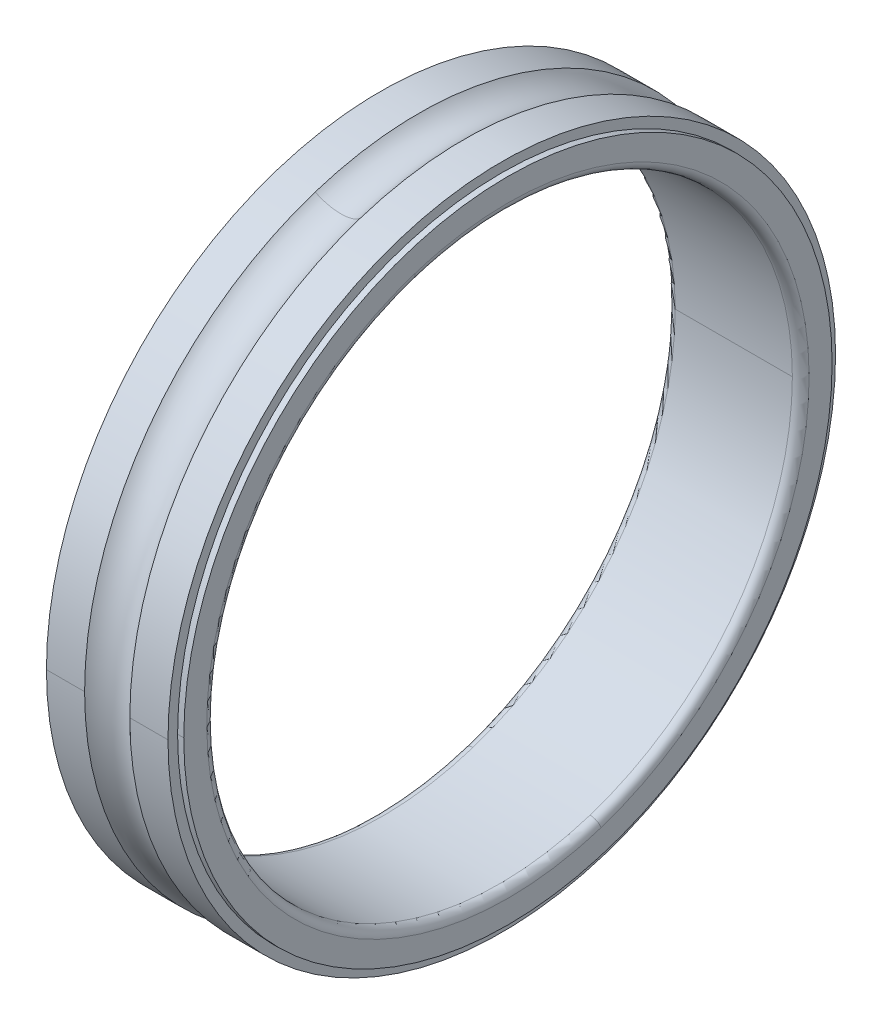
ISO-10303-21;
HEADER;
FILE_DESCRIPTION(('STEP AP214'),'2;1');
FILE_NAME('part.step','',(''),(''),'','','');
FILE_SCHEMA(('AUTOMOTIVE_DESIGN { 1 0 10303 214 1 1 1 1 }'));
ENDSEC;
DATA;
#1=APPLICATION_CONTEXT('core data for automotive mechanical design processes');
#2=APPLICATION_PROTOCOL_DEFINITION('international standard','automotive_design',2000,#1);
#3=PRODUCT_CONTEXT('',#1,'mechanical');
#4=PRODUCT('Part','Part','',(#3));
#5=PRODUCT_RELATED_PRODUCT_CATEGORY('part','',(#4));
#6=PRODUCT_DEFINITION_FORMATION('','',#4);
#7=PRODUCT_DEFINITION_CONTEXT('part definition',#1,'design');
#8=PRODUCT_DEFINITION('design','',#6,#7);
#9=PRODUCT_DEFINITION_SHAPE('','',#8);
#10=(LENGTH_UNIT() NAMED_UNIT(*) SI_UNIT(.MILLI.,.METRE.));
#11=(NAMED_UNIT(*) PLANE_ANGLE_UNIT() SI_UNIT($,.RADIAN.));
#12=(NAMED_UNIT(*) SI_UNIT($,.STERADIAN.) SOLID_ANGLE_UNIT());
#13=UNCERTAINTY_MEASURE_WITH_UNIT(LENGTH_MEASURE(1.E-05),#10,'distance_accuracy_value','');
#14=(GEOMETRIC_REPRESENTATION_CONTEXT(3) GLOBAL_UNCERTAINTY_ASSIGNED_CONTEXT((#13)) GLOBAL_UNIT_ASSIGNED_CONTEXT((#10,
#11,#12)) REPRESENTATION_CONTEXT('',''));
#15=CARTESIAN_POINT('',(0.,0.,0.));
#16=DIRECTION('',(0.,0.,1.));
#17=DIRECTION('',(1.,0.,0.));
#18=AXIS2_PLACEMENT_3D('',#15,#16,#17);
#19=CARTESIAN_POINT('',(0.,38.75,0.));
#20=DIRECTION('',(-1.,0.,0.));
#21=DIRECTION('',(0.,0.,1.));
#22=AXIS2_PLACEMENT_3D('',#19,#20,#21);
#23=PLANE('',#22);
#24=CARTESIAN_POINT('',(0.,0.,0.));
#25=DIRECTION('',(1.,0.,0.));
#26=DIRECTION('',(0.,0.,-1.));
#27=AXIS2_PLACEMENT_3D('',#24,#25,#26);
#28=CIRCLE('',#27,36.);
#29=CARTESIAN_POINT('',(0.,34.2380345866248,11.1246117974979));
#30=VERTEX_POINT('',#29);
#31=CARTESIAN_POINT('',(0.,-34.2380345866248,-11.1246117974979));
#32=VERTEX_POINT('',#31);
#33=EDGE_CURVE('E11',#30,#32,#28,.T.);
#34=ORIENTED_EDGE('',*,*,#33,.T.);
#35=CARTESIAN_POINT('',(0.,-34.2380345866255,-11.1246117974981));
#36=CARTESIAN_POINT('',(0.,-32.4905136770944,-16.5026593726978));
#37=CARTESIAN_POINT('',(0.,-29.6874505260452,-21.5379081719055));
#38=CARTESIAN_POINT('',(0.,-25.9167563443921,-25.9525858908717));
#39=CARTESIAN_POINT('',(0.,-16.8476383750228,-33.0653394526487));
#40=CARTESIAN_POINT('',(0.,-5.76259886805708,-36.2216746869559));
#41=CARTESIAN_POINT('',(0.,0.0253366989584197,-36.6772049650104));
#42=CARTESIAN_POINT('',(0.,11.4676440686657,-35.2937793603178));
#43=CARTESIAN_POINT('',(0.,21.5378223537027,-29.6873746608561));
#44=CARTESIAN_POINT('',(0.,25.9526066103522,-25.9167797569469));
#45=CARTESIAN_POINT('',(0.,33.0653446527884,-16.8476281691741));
#46=CARTESIAN_POINT('',(0.,36.2216435671959,-5.76259586719968));
#47=CARTESIAN_POINT('',(0.,36.6773167839117,0.0253118630132665));
#48=CARTESIAN_POINT('',(0.,35.9853975236189,5.74651289390937));
#49=CARTESIAN_POINT('',(0.,34.2380345866255,11.1246117974981));
#50=B_SPLINE_CURVE_WITH_KNOTS('',5,(#35,#36,#37,#38,#39,#40,#41,#42,#43,#44,#45,#46,#47,#48,
#49),.UNSPECIFIED.,.F.,.F.,(6,3,3,3,6),(0.,0.785398163397448,1.5707963267949,2.35619449019234,
3.14159265358979),.UNSPECIFIED.);
#51=EDGE_CURVE('E28',#32,#30,#50,.T.);
#52=ORIENTED_EDGE('',*,*,#51,.T.);
#53=EDGE_LOOP('',(#34,#52));
#54=FACE_BOUND('',#53,.T.);
#55=CARTESIAN_POINT('',(0.,0.,0.));
#56=DIRECTION('',(1.,0.,0.));
#57=DIRECTION('',(0.,0.,-1.));
#58=AXIS2_PLACEMENT_3D('',#55,#56,#57);
#59=CIRCLE('',#58,38.75);
#60=CARTESIAN_POINT('',(0.,0.,38.75));
#61=VERTEX_POINT('',#60);
#62=CARTESIAN_POINT('',(0.,0.,-38.75));
#63=VERTEX_POINT('',#62);
#64=EDGE_CURVE('E402',#61,#63,#59,.T.);
#65=ORIENTED_EDGE('',*,*,#64,.F.);
#66=CARTESIAN_POINT('',(0.,0.,0.));
#67=DIRECTION('',(1.,0.,0.));
#68=DIRECTION('',(0.,0.,-1.));
#69=AXIS2_PLACEMENT_3D('',#66,#67,#68);
#70=CIRCLE('',#69,38.75);
#71=EDGE_CURVE('E397',#63,#61,#70,.T.);
#72=ORIENTED_EDGE('',*,*,#71,.F.);
#73=EDGE_LOOP('',(#65,#72));
#74=FACE_BOUND('',#73,.T.);
#75=ADVANCED_FACE('F19',(#54,#74),#23,.T.);
#76=CARTESIAN_POINT('',(16.,0.,0.));
#77=DIRECTION('',(1.,0.,0.));
#78=DIRECTION('',(0.,-1.,0.));
#79=AXIS2_PLACEMENT_3D('',#76,#77,#78);
#80=CYLINDRICAL_SURFACE('',#79,38.75);
#81=DIRECTION('',(1.,0.,0.));
#82=VECTOR('',#81,1.);
#83=CARTESIAN_POINT('',(0.,0.,38.75));
#84=LINE('',#83,#82);
#85=CARTESIAN_POINT('',(0.736000000000001,0.,38.75));
#86=VERTEX_POINT('',#85);
#87=EDGE_CURVE('E393',#61,#86,#84,.T.);
#88=ORIENTED_EDGE('',*,*,#87,.T.);
#89=CARTESIAN_POINT('',(0.736,0.,0.));
#90=DIRECTION('',(1.,0.,0.));
#91=DIRECTION('',(0.,0.,-1.));
#92=AXIS2_PLACEMENT_3D('',#89,#90,#91);
#93=CIRCLE('',#92,38.75);
#94=CARTESIAN_POINT('',(0.736,0.,-38.75));
#95=VERTEX_POINT('',#94);
#96=EDGE_CURVE('E388',#95,#86,#93,.T.);
#97=ORIENTED_EDGE('',*,*,#96,.F.);
#98=DIRECTION('',(1.,0.,0.));
#99=VECTOR('',#98,1.);
#100=CARTESIAN_POINT('',(0.,0.,-38.75));
#101=LINE('',#100,#99);
#102=EDGE_CURVE('E383',#63,#95,#101,.T.);
#103=ORIENTED_EDGE('',*,*,#102,.F.);
#104=ORIENTED_EDGE('',*,*,#71,.T.);
#105=EDGE_LOOP('',(#88,#97,#103,#104));
#106=FACE_BOUND('',#105,.T.);
#107=ADVANCED_FACE('F423',(#106),#80,.T.);
#108=CARTESIAN_POINT('',(16.,0.,0.));
#109=DIRECTION('',(1.,0.,0.));
#110=DIRECTION('',(0.,1.,0.));
#111=AXIS2_PLACEMENT_3D('',#108,#109,#110);
#112=CYLINDRICAL_SURFACE('',#111,38.75);
#113=ORIENTED_EDGE('',*,*,#87,.F.);
#114=ORIENTED_EDGE('',*,*,#64,.T.);
#115=ORIENTED_EDGE('',*,*,#102,.T.);
#116=CARTESIAN_POINT('',(0.736,0.,0.));
#117=DIRECTION('',(1.,0.,0.));
#118=DIRECTION('',(0.,0.,-1.));
#119=AXIS2_PLACEMENT_3D('',#116,#117,#118);
#120=CIRCLE('',#119,38.75);
#121=EDGE_CURVE('E378',#86,#95,#120,.T.);
#122=ORIENTED_EDGE('',*,*,#121,.F.);
#123=EDGE_LOOP('',(#113,#114,#115,#122));
#124=FACE_BOUND('',#123,.T.);
#125=ADVANCED_FACE('F418',(#124),#112,.T.);
#126=CARTESIAN_POINT('',(0.736,39.9,0.));
#127=DIRECTION('',(-1.,0.,0.));
#128=DIRECTION('',(0.,0.,1.));
#129=AXIS2_PLACEMENT_3D('',#126,#127,#128);
#130=PLANE('',#129);
#131=ORIENTED_EDGE('',*,*,#96,.T.);
#132=ORIENTED_EDGE('',*,*,#121,.T.);
#133=EDGE_LOOP('',(#131,#132));
#134=FACE_BOUND('',#133,.T.);
#135=CARTESIAN_POINT('',(0.736,0.,0.));
#136=DIRECTION('',(1.,0.,0.));
#137=DIRECTION('',(0.,0.,-1.));
#138=AXIS2_PLACEMENT_3D('',#135,#136,#137);
#139=CIRCLE('',#138,39.9);
#140=CARTESIAN_POINT('',(0.736000000000001,0.,39.9));
#141=VERTEX_POINT('',#140);
#142=CARTESIAN_POINT('',(0.736,0.,-39.9));
#143=VERTEX_POINT('',#142);
#144=EDGE_CURVE('E373',#141,#143,#139,.T.);
#145=ORIENTED_EDGE('',*,*,#144,.F.);
#146=CARTESIAN_POINT('',(0.736,0.,0.));
#147=DIRECTION('',(1.,0.,0.));
#148=DIRECTION('',(0.,0.,-1.));
#149=AXIS2_PLACEMENT_3D('',#146,#147,#148);
#150=CIRCLE('',#149,39.9);
#151=EDGE_CURVE('E368',#143,#141,#150,.T.);
#152=ORIENTED_EDGE('',*,*,#151,.F.);
#153=EDGE_LOOP('',(#145,#152));
#154=FACE_BOUND('',#153,.T.);
#155=ADVANCED_FACE('F425',(#134,#154),#130,.T.);
#156=CARTESIAN_POINT('',(16.,0.,0.));
#157=DIRECTION('',(1.,0.,0.));
#158=DIRECTION('',(0.,-1.,0.));
#159=AXIS2_PLACEMENT_3D('',#156,#157,#158);
#160=CYLINDRICAL_SURFACE('',#159,39.9);
#161=DIRECTION('',(1.,0.,0.));
#162=VECTOR('',#161,1.);
#163=CARTESIAN_POINT('',(0.736000000000001,0.,39.9));
#164=LINE('',#163,#162);
#165=CARTESIAN_POINT('',(5.2976861766257,0.,39.9));
#166=VERTEX_POINT('',#165);
#167=EDGE_CURVE('E364',#141,#166,#164,.T.);
#168=ORIENTED_EDGE('',*,*,#167,.T.);
#169=CARTESIAN_POINT('',(5.2976861766257,0.,0.));
#170=DIRECTION('',(1.,0.,0.));
#171=DIRECTION('',(0.,0.,-1.));
#172=AXIS2_PLACEMENT_3D('',#169,#170,#171);
#173=CIRCLE('',#172,39.9);
#174=CARTESIAN_POINT('',(5.29768617662592,37.9471550001768,12.3297780755605));
#175=VERTEX_POINT('',#174);
#176=EDGE_CURVE('E359',#175,#166,#173,.T.);
#177=ORIENTED_EDGE('',*,*,#176,.F.);
#178=CARTESIAN_POINT('',(5.2976861766257,0.,0.));
#179=DIRECTION('',(1.,0.,0.));
#180=DIRECTION('',(0.,0.,-1.));
#181=AXIS2_PLACEMENT_3D('',#178,#179,#180);
#182=CIRCLE('',#181,39.9);
#183=CARTESIAN_POINT('',(5.2976861766257,0.,-39.9));
#184=VERTEX_POINT('',#183);
#185=EDGE_CURVE('E354',#184,#175,#182,.T.);
#186=ORIENTED_EDGE('',*,*,#185,.F.);
#187=DIRECTION('',(1.,0.,0.));
#188=VECTOR('',#187,1.);
#189=CARTESIAN_POINT('',(0.736000000000001,0.,-39.9));
#190=LINE('',#189,#188);
#191=EDGE_CURVE('E349',#143,#184,#190,.T.);
#192=ORIENTED_EDGE('',*,*,#191,.F.);
#193=ORIENTED_EDGE('',*,*,#151,.T.);
#194=EDGE_LOOP('',(#168,#177,#186,#192,#193));
#195=FACE_BOUND('',#194,.T.);
#196=ADVANCED_FACE('F428',(#195),#160,.T.);
#197=CARTESIAN_POINT('',(16.,0.,0.));
#198=DIRECTION('',(1.,0.,0.));
#199=DIRECTION('',(0.,1.,0.));
#200=AXIS2_PLACEMENT_3D('',#197,#198,#199);
#201=CYLINDRICAL_SURFACE('',#200,39.9);
#202=ORIENTED_EDGE('',*,*,#167,.F.);
#203=ORIENTED_EDGE('',*,*,#144,.T.);
#204=ORIENTED_EDGE('',*,*,#191,.T.);
#205=CARTESIAN_POINT('',(5.2976861766257,0.,0.));
#206=DIRECTION('',(1.,0.,0.));
#207=DIRECTION('',(0.,0.,-1.));
#208=AXIS2_PLACEMENT_3D('',#205,#206,#207);
#209=CIRCLE('',#208,39.9);
#210=CARTESIAN_POINT('',(5.29768617662592,-37.9471550001768,-12.3297780755605));
#211=VERTEX_POINT('',#210);
#212=EDGE_CURVE('E344',#211,#184,#209,.T.);
#213=ORIENTED_EDGE('',*,*,#212,.F.);
#214=CARTESIAN_POINT('',(5.2976861766257,0.,0.));
#215=DIRECTION('',(1.,0.,0.));
#216=DIRECTION('',(0.,0.,-1.));
#217=AXIS2_PLACEMENT_3D('',#214,#215,#216);
#218=CIRCLE('',#217,39.9);
#219=EDGE_CURVE('E339',#166,#211,#218,.T.);
#220=ORIENTED_EDGE('',*,*,#219,.F.);
#221=EDGE_LOOP('',(#202,#203,#204,#213,#220));
#222=FACE_BOUND('',#221,.T.);
#223=ADVANCED_FACE('F434',(#222),#201,.T.);
#224=CARTESIAN_POINT('',(7.99999999999985,0.,0.));
#225=DIRECTION('',(1.,0.,0.));
#226=DIRECTION('',(0.,0.309016994374947,-0.951056516295154));
#227=AXIS2_PLACEMENT_3D('',#224,#225,#226);
#228=TOROIDAL_SURFACE('',#227,42.5,3.74999999999958);
#229=CARTESIAN_POINT('',(7.99999999999985,-40.419901942544,-13.1332222609353));
#230=DIRECTION('',(0.,0.309016994374948,-0.951056516295154));
#231=DIRECTION('',(-0.720617019566464,0.659399184631331,0.214251782766638));
#232=AXIS2_PLACEMENT_3D('',#229,#230,#231);
#233=CIRCLE('',#232,3.74999999999957);
#234=CARTESIAN_POINT('',(10.7023138233738,-37.9471550001768,-12.3297780755605));
#235=VERTEX_POINT('',#234);
#236=EDGE_CURVE('E335',#211,#235,#233,.T.);
#237=ORIENTED_EDGE('',*,*,#236,.T.);
#238=CARTESIAN_POINT('',(10.702313823374,0.,0.));
#239=DIRECTION('',(1.,0.,0.));
#240=DIRECTION('',(0.,0.,-1.));
#241=AXIS2_PLACEMENT_3D('',#238,#239,#240);
#242=CIRCLE('',#241,39.9);
#243=CARTESIAN_POINT('',(10.702313823374,0.,39.9));
#244=VERTEX_POINT('',#243);
#245=EDGE_CURVE('E330',#244,#235,#242,.T.);
#246=ORIENTED_EDGE('',*,*,#245,.F.);
#247=CARTESIAN_POINT('',(10.702313823374,0.,0.));
#248=DIRECTION('',(1.,0.,0.));
#249=DIRECTION('',(0.,0.,-1.));
#250=AXIS2_PLACEMENT_3D('',#247,#248,#249);
#251=CIRCLE('',#250,39.9);
#252=CARTESIAN_POINT('',(10.7023138233738,37.9471550001768,12.3297780755605));
#253=VERTEX_POINT('',#252);
#254=EDGE_CURVE('E325',#253,#244,#251,.T.);
#255=ORIENTED_EDGE('',*,*,#254,.F.);
#256=CARTESIAN_POINT('',(7.99999999999985,40.419901942544,13.1332222609353));
#257=DIRECTION('',(0.,-0.309016994374948,0.951056516295154));
#258=DIRECTION('',(-0.720617019566465,-0.659399184631329,-0.214251782766638));
#259=AXIS2_PLACEMENT_3D('',#256,#257,#258);
#260=CIRCLE('',#259,3.74999999999957);
#261=EDGE_CURVE('E320',#175,#253,#260,.T.);
#262=ORIENTED_EDGE('',*,*,#261,.F.);
#263=ORIENTED_EDGE('',*,*,#176,.T.);
#264=ORIENTED_EDGE('',*,*,#219,.T.);
#265=EDGE_LOOP('',(#237,#246,#255,#262,#263,#264));
#266=FACE_BOUND('',#265,.T.);
#267=ADVANCED_FACE('F441',(#266),#228,.F.);
#268=CARTESIAN_POINT('',(7.99999999999985,0.,0.));
#269=DIRECTION('',(1.,0.,0.));
#270=DIRECTION('',(0.,-0.309016994374947,0.951056516295154));
#271=AXIS2_PLACEMENT_3D('',#268,#269,#270);
#272=TOROIDAL_SURFACE('',#271,42.5,3.74999999999958);
#273=ORIENTED_EDGE('',*,*,#236,.F.);
#274=ORIENTED_EDGE('',*,*,#212,.T.);
#275=ORIENTED_EDGE('',*,*,#185,.T.);
#276=ORIENTED_EDGE('',*,*,#261,.T.);
#277=CARTESIAN_POINT('',(10.702313823374,0.,0.));
#278=DIRECTION('',(1.,0.,0.));
#279=DIRECTION('',(0.,0.,-1.));
#280=AXIS2_PLACEMENT_3D('',#277,#278,#279);
#281=CIRCLE('',#280,39.9);
#282=CARTESIAN_POINT('',(10.702313823374,0.,-39.9));
#283=VERTEX_POINT('',#282);
#284=EDGE_CURVE('E315',#283,#253,#281,.T.);
#285=ORIENTED_EDGE('',*,*,#284,.F.);
#286=CARTESIAN_POINT('',(10.702313823374,0.,0.));
#287=DIRECTION('',(1.,0.,0.));
#288=DIRECTION('',(0.,0.,-1.));
#289=AXIS2_PLACEMENT_3D('',#286,#287,#288);
#290=CIRCLE('',#289,39.9);
#291=EDGE_CURVE('E310',#235,#283,#290,.T.);
#292=ORIENTED_EDGE('',*,*,#291,.F.);
#293=EDGE_LOOP('',(#273,#274,#275,#276,#285,#292));
#294=FACE_BOUND('',#293,.T.);
#295=ADVANCED_FACE('F438',(#294),#272,.F.);
#296=CARTESIAN_POINT('',(16.,0.,0.));
#297=DIRECTION('',(1.,0.,0.));
#298=DIRECTION('',(0.,1.,0.));
#299=AXIS2_PLACEMENT_3D('',#296,#297,#298);
#300=CYLINDRICAL_SURFACE('',#299,39.9);
#301=DIRECTION('',(1.,0.,0.));
#302=VECTOR('',#301,1.);
#303=CARTESIAN_POINT('',(10.702313823374,0.,39.9));
#304=LINE('',#303,#302);
#305=CARTESIAN_POINT('',(15.264,0.,39.9));
#306=VERTEX_POINT('',#305);
#307=EDGE_CURVE('E305',#244,#306,#304,.T.);
#308=ORIENTED_EDGE('',*,*,#307,.F.);
#309=ORIENTED_EDGE('',*,*,#245,.T.);
#310=ORIENTED_EDGE('',*,*,#291,.T.);
#311=DIRECTION('',(1.,0.,0.));
#312=VECTOR('',#311,1.);
#313=CARTESIAN_POINT('',(10.702313823374,0.,-39.9));
#314=LINE('',#313,#312);
#315=CARTESIAN_POINT('',(15.264,0.,-39.9));
#316=VERTEX_POINT('',#315);
#317=EDGE_CURVE('E301',#283,#316,#314,.T.);
#318=ORIENTED_EDGE('',*,*,#317,.T.);
#319=CARTESIAN_POINT('',(15.264,0.,0.));
#320=DIRECTION('',(1.,0.,0.));
#321=DIRECTION('',(0.,0.,-1.));
#322=AXIS2_PLACEMENT_3D('',#319,#320,#321);
#323=CIRCLE('',#322,39.9);
#324=EDGE_CURVE('E296',#306,#316,#323,.T.);
#325=ORIENTED_EDGE('',*,*,#324,.F.);
#326=EDGE_LOOP('',(#308,#309,#310,#318,#325));
#327=FACE_BOUND('',#326,.T.);
#328=ADVANCED_FACE('F447',(#327),#300,.T.);
#329=CARTESIAN_POINT('',(15.264,38.75,0.));
#330=DIRECTION('',(1.,0.,0.));
#331=DIRECTION('',(0.,0.,-1.));
#332=AXIS2_PLACEMENT_3D('',#329,#330,#331);
#333=PLANE('',#332);
#334=CARTESIAN_POINT('',(15.264,0.,0.));
#335=DIRECTION('',(1.,0.,0.));
#336=DIRECTION('',(0.,0.,-1.));
#337=AXIS2_PLACEMENT_3D('',#334,#335,#336);
#338=CIRCLE('',#337,39.9);
#339=EDGE_CURVE('E291',#316,#306,#338,.T.);
#340=ORIENTED_EDGE('',*,*,#339,.T.);
#341=ORIENTED_EDGE('',*,*,#324,.T.);
#342=EDGE_LOOP('',(#340,#341));
#343=FACE_BOUND('',#342,.T.);
#344=CARTESIAN_POINT('',(15.264,0.,0.));
#345=DIRECTION('',(1.,0.,0.));
#346=DIRECTION('',(0.,0.,-1.));
#347=AXIS2_PLACEMENT_3D('',#344,#345,#346);
#348=CIRCLE('',#347,38.75);
#349=CARTESIAN_POINT('',(15.264,0.,38.75));
#350=VERTEX_POINT('',#349);
#351=CARTESIAN_POINT('',(15.264,0.,-38.75));
#352=VERTEX_POINT('',#351);
#353=EDGE_CURVE('E286',#350,#352,#348,.T.);
#354=ORIENTED_EDGE('',*,*,#353,.F.);
#355=CARTESIAN_POINT('',(15.264,0.,0.));
#356=DIRECTION('',(1.,0.,0.));
#357=DIRECTION('',(0.,0.,-1.));
#358=AXIS2_PLACEMENT_3D('',#355,#356,#357);
#359=CIRCLE('',#358,38.75);
#360=EDGE_CURVE('E281',#352,#350,#359,.T.);
#361=ORIENTED_EDGE('',*,*,#360,.F.);
#362=EDGE_LOOP('',(#354,#361));
#363=FACE_BOUND('',#362,.T.);
#364=ADVANCED_FACE('F451',(#343,#363),#333,.T.);
#365=CARTESIAN_POINT('',(16.,0.,0.));
#366=DIRECTION('',(1.,0.,0.));
#367=DIRECTION('',(0.,-1.,0.));
#368=AXIS2_PLACEMENT_3D('',#365,#366,#367);
#369=CYLINDRICAL_SURFACE('',#368,38.75);
#370=DIRECTION('',(1.,0.,0.));
#371=VECTOR('',#370,1.);
#372=CARTESIAN_POINT('',(15.264,0.,38.75));
#373=LINE('',#372,#371);
#374=CARTESIAN_POINT('',(16.,0.,38.75));
#375=VERTEX_POINT('',#374);
#376=EDGE_CURVE('E277',#350,#375,#373,.T.);
#377=ORIENTED_EDGE('',*,*,#376,.T.);
#378=CARTESIAN_POINT('',(16.,0.,0.));
#379=DIRECTION('',(1.,0.,0.));
#380=DIRECTION('',(0.,0.,-1.));
#381=AXIS2_PLACEMENT_3D('',#378,#379,#380);
#382=CIRCLE('',#381,38.75);
#383=CARTESIAN_POINT('',(16.,0.,-38.75));
#384=VERTEX_POINT('',#383);
#385=EDGE_CURVE('E272',#384,#375,#382,.T.);
#386=ORIENTED_EDGE('',*,*,#385,.F.);
#387=DIRECTION('',(1.,0.,0.));
#388=VECTOR('',#387,1.);
#389=CARTESIAN_POINT('',(15.264,0.,-38.75));
#390=LINE('',#389,#388);
#391=EDGE_CURVE('E267',#352,#384,#390,.T.);
#392=ORIENTED_EDGE('',*,*,#391,.F.);
#393=ORIENTED_EDGE('',*,*,#360,.T.);
#394=EDGE_LOOP('',(#377,#386,#392,#393));
#395=FACE_BOUND('',#394,.T.);
#396=ADVANCED_FACE('F454',(#395),#369,.T.);
#397=CARTESIAN_POINT('',(16.,0.,0.));
#398=DIRECTION('',(1.,0.,0.));
#399=DIRECTION('',(0.,1.,0.));
#400=AXIS2_PLACEMENT_3D('',#397,#398,#399);
#401=CYLINDRICAL_SURFACE('',#400,38.75);
#402=ORIENTED_EDGE('',*,*,#376,.F.);
#403=ORIENTED_EDGE('',*,*,#353,.T.);
#404=ORIENTED_EDGE('',*,*,#391,.T.);
#405=CARTESIAN_POINT('',(16.,0.,0.));
#406=DIRECTION('',(1.,0.,0.));
#407=DIRECTION('',(0.,0.,-1.));
#408=AXIS2_PLACEMENT_3D('',#405,#406,#407);
#409=CIRCLE('',#408,38.75);
#410=EDGE_CURVE('E264',#375,#384,#409,.T.);
#411=ORIENTED_EDGE('',*,*,#410,.F.);
#412=EDGE_LOOP('',(#402,#403,#404,#411));
#413=FACE_BOUND('',#412,.T.);
#414=ADVANCED_FACE('F460',(#413),#401,.T.);
#415=CARTESIAN_POINT('',(16.,36.,0.));
#416=DIRECTION('',(1.,0.,0.));
#417=DIRECTION('',(0.,0.,-1.));
#418=AXIS2_PLACEMENT_3D('',#415,#416,#417);
#419=PLANE('',#418);
#420=ORIENTED_EDGE('',*,*,#385,.T.);
#421=ORIENTED_EDGE('',*,*,#410,.T.);
#422=EDGE_LOOP('',(#420,#421));
#423=FACE_BOUND('',#422,.T.);
#424=CARTESIAN_POINT('',(16.,-34.238034586624,-11.1246117974977));
#425=CARTESIAN_POINT('',(16.,-34.0560202515641,-11.6848347553448));
#426=CARTESIAN_POINT('',(16.,-33.8602330694235,-12.2405815259679));
#427=CARTESIAN_POINT('',(16.,-33.4416360222106,-13.3418033662211));
#428=CARTESIAN_POINT('',(16.,-33.2188261571385,-13.8872784358512));
#429=CARTESIAN_POINT('',(16.,-32.7467067552925,-14.9666375475738));
#430=CARTESIAN_POINT('',(16.,-32.4973972185186,-15.5005215896662));
#431=CARTESIAN_POINT('',(16.,-31.9728827680247,-16.5554138740863));
#432=CARTESIAN_POINT('',(16.,-31.6976778543046,-17.076422116414));
#433=CARTESIAN_POINT('',(16.,-31.1220346549341,-18.1043072713654));
#434=CARTESIAN_POINT('',(16.,-30.8215963692837,-18.6111841839891));
#435=CARTESIAN_POINT('',(16.,-30.1962104728585,-19.609585669254));
#436=CARTESIAN_POINT('',(16.,-29.8712628620837,-20.1011102418952));
#437=CARTESIAN_POINT('',(16.,-29.1976410717506,-21.0676228944912));
#438=CARTESIAN_POINT('',(16.,-28.8489668921923,-21.5426109744459));
#439=CARTESIAN_POINT('',(16.,-28.1287319699327,-22.4749063610031));
#440=CARTESIAN_POINT('',(16.,-27.7571712272314,-22.9322136676055));
#441=CARTESIAN_POINT('',(16.,-26.9920582959684,-23.8280458121658));
#442=CARTESIAN_POINT('',(16.,-26.5985061074067,-24.2665706501236));
#443=CARTESIAN_POINT('',(16.,-25.7903583874804,-25.1237814131682));
#444=CARTESIAN_POINT('',(16.,-25.3757628561159,-25.5424673382551));
#445=CARTESIAN_POINT('',(16.,-24.5265272471677,-26.3589916243529));
#446=CARTESIAN_POINT('',(16.,-24.0918871695841,-26.7568299853637));
#447=CARTESIAN_POINT('',(16.,-23.2036095543128,-27.5307007158886));
#448=CARTESIAN_POINT('',(16.,-22.749972016625,-27.9067330854025));
#449=CARTESIAN_POINT('',(16.,-21.8247923336811,-28.6360859380087));
#450=CARTESIAN_POINT('',(16.,-21.3532501884251,-28.989406421101));
#451=CARTESIAN_POINT('',(16.,-20.393397276682,-29.6724843208757));
#452=CARTESIAN_POINT('',(16.,-19.905086510195,-30.0022417375581));
#453=CARTESIAN_POINT('',(16.,-18.9128727393953,-30.637399090012));
#454=CARTESIAN_POINT('',(16.,-18.4089697350828,-30.9427990257836));
#455=CARTESIAN_POINT('',(16.,-17.3867854351068,-31.5285056812209));
#456=CARTESIAN_POINT('',(16.,-16.8685041394433,-31.8088124008868));
#457=CARTESIAN_POINT('',(16.,-15.8188118418026,-32.343657340673));
#458=CARTESIAN_POINT('',(16.,-15.2874008398255,-32.5981955607934));
#459=CARTESIAN_POINT('',(16.,-14.2127293452073,-33.0808902966215));
#460=CARTESIAN_POINT('',(16.,-13.6694688525663,-33.3090468123293));
#461=CARTESIAN_POINT('',(16.,-12.5724071387313,-33.7384284903017));
#462=CARTESIAN_POINT('',(16.,-12.0186059175373,-33.9396536525664));
#463=CARTESIAN_POINT('',(16.,-10.9017969022453,-34.3146878546115));
#464=CARTESIAN_POINT('',(16.,-10.3387891081474,-34.4884968943919));
#465=CARTESIAN_POINT('',(16.,-9.20492328213716,-34.8082801302678));
#466=CARTESIAN_POINT('',(16.,-8.63406525022492,-34.9542543263632));
#467=CARTESIAN_POINT('',(16.,-7.48587419558629,-35.218016210245));
#468=CARTESIAN_POINT('',(16.,-6.9085411728599,-35.3358038980313));
#469=CARTESIAN_POINT('',(16.,-5.74879098241311,-35.5429090044379));
#470=CARTESIAN_POINT('',(16.,-5.16637381469272,-35.6322264230581));
#471=CARTESIAN_POINT('',(16.,-3.99785842822867,-35.7821758176479));
#472=CARTESIAN_POINT('',(16.,-3.41176020948503,-35.8428077936174));
#473=CARTESIAN_POINT('',(16.,-2.23729468291958,-35.9352402351647));
#474=CARTESIAN_POINT('',(16.,-1.64892737509779,-35.9670407007426));
#475=CARTESIAN_POINT('',(16.,-0.471341098755479,-36.0017335113998));
#476=CARTESIAN_POINT('',(16.,0.117877869765028,-36.0046258564791));
#477=CARTESIAN_POINT('',(16.,1.29574798740012,-35.9814954582265));
#478=CARTESIAN_POINT('',(16.,1.8843991365147,-35.9554727148945));
#479=CARTESIAN_POINT('',(16.,3.05971550315996,-35.8745748308875));
#480=CARTESIAN_POINT('',(16.,3.64638072069064,-35.8196996902124));
#481=CARTESIAN_POINT('',(16.,4.81631189627325,-35.6812292105393));
#482=CARTESIAN_POINT('',(16.,5.39957785432519,-35.5976338715413));
#483=CARTESIAN_POINT('',(16.,6.56130537216933,-35.4019243837163));
#484=CARTESIAN_POINT('',(16.,7.13976693196153,-35.2898102348892));
#485=CARTESIAN_POINT('',(16.,8.29049208872139,-35.0373332202106));
#486=CARTESIAN_POINT('',(16.,8.86275568568905,-34.896970354359));
#487=CARTESIAN_POINT('',(16.,9.99970628367037,-34.5883340520694));
#488=CARTESIAN_POINT('',(16.,10.564393284684,-34.4200606156315));
#489=CARTESIAN_POINT('',(16.,11.6848303103112,-34.0560085576166));
#490=CARTESIAN_POINT('',(16.,12.2405803349246,-33.8602299360397));
#491=CARTESIAN_POINT('',(16.,13.3418045572641,-33.4416391555945));
#492=CARTESIAN_POINT('',(16.,13.8872787549902,-33.2188269967261));
#493=CARTESIAN_POINT('',(16.,14.9666372284346,-32.7467059157048));
#494=CARTESIAN_POINT('',(16.,15.500521504153,-32.4973969935519));
#495=CARTESIAN_POINT('',(16.,16.5554139595992,-31.9728829929916));
#496=CARTESIAN_POINT('',(16.,17.076422139327,-31.6976779145843));
#497=CARTESIAN_POINT('',(16.,18.1043072484521,-31.1220345946544));
#498=CARTESIAN_POINT('',(16.,18.6111841778494,-30.8215963531318));
#499=CARTESIAN_POINT('',(16.,19.6095856753935,-30.1962104890105));
#500=CARTESIAN_POINT('',(16.,20.1011102435402,-29.8712628664117));
#501=CARTESIAN_POINT('',(16.,21.067622892846,-29.1976410674228));
#502=CARTESIAN_POINT('',(16.,21.542610974005,-28.8489668910327));
#503=CARTESIAN_POINT('',(16.,22.4749063614438,-28.1287319710924));
#504=CARTESIAN_POINT('',(16.,22.9322136677235,-27.7571712275422));
#505=CARTESIAN_POINT('',(16.,23.8280458120476,-26.9920582956577));
#506=CARTESIAN_POINT('',(16.,24.2665706500918,-26.5985061073235));
#507=CARTESIAN_POINT('',(16.,25.1237814131998,-25.7903583875637));
#508=CARTESIAN_POINT('',(16.,25.5424673382635,-25.3757628561382));
#509=CARTESIAN_POINT('',(16.,26.3589916243443,-24.5265272471455));
#510=CARTESIAN_POINT('',(16.,26.7568299853614,-24.0918871695782));
#511=CARTESIAN_POINT('',(16.,27.5307007158908,-23.2036095543188));
#512=CARTESIAN_POINT('',(16.,27.906733085403,-22.7499720166266));
#513=CARTESIAN_POINT('',(16.,28.6360859380081,-21.8247923336796));
#514=CARTESIAN_POINT('',(16.,28.9894064211008,-21.3532501884248));
#515=CARTESIAN_POINT('',(16.,29.6724843208758,-20.3933972766826));
#516=CARTESIAN_POINT('',(16.,30.002241737558,-19.9050865101952));
#517=CARTESIAN_POINT('',(16.,30.6373990900119,-18.9128727393953));
#518=CARTESIAN_POINT('',(16.,30.9427990257835,-18.4089697350829));
#519=CARTESIAN_POINT('',(16.,31.5285056812209,-17.3867854351069));
#520=CARTESIAN_POINT('',(16.,31.8088124008867,-16.8685041394434));
#521=CARTESIAN_POINT('',(16.,32.3436573406729,-15.8188118418027));
#522=CARTESIAN_POINT('',(16.,32.5981955607933,-15.2874008398256));
#523=CARTESIAN_POINT('',(16.,33.0808902966215,-14.2127293452074));
#524=CARTESIAN_POINT('',(16.,33.3090468123294,-13.6694688525664));
#525=CARTESIAN_POINT('',(16.,33.7384284903016,-12.5724071387314));
#526=CARTESIAN_POINT('',(16.,33.9396536525659,-12.0186059175375));
#527=CARTESIAN_POINT('',(16.,34.3146878546119,-10.9017969022453));
#528=CARTESIAN_POINT('',(16.,34.4884968943935,-10.338789108147));
#529=CARTESIAN_POINT('',(16.,34.8082801302661,-9.2049232821377));
#530=CARTESIAN_POINT('',(16.,34.954254326357,-8.63406525022669));
#531=CARTESIAN_POINT('',(16.,35.2180162102511,-7.48587419558471));
#532=CARTESIAN_POINT('',(16.,35.3358038980543,-6.90854117285374));
#533=CARTESIAN_POINT('',(16.,35.5429090044148,-5.74879098241946));
#534=CARTESIAN_POINT('',(16.,35.6322264229721,-5.16637381471615));
#535=CARTESIAN_POINT('',(16.,35.7821758177338,-3.99785842820544));
#536=CARTESIAN_POINT('',(16.,35.8428077939382,-3.41176020939805));
#537=CARTESIAN_POINT('',(16.,35.9352402348439,-2.23729468300679));
#538=CARTESIAN_POINT('',(16.,35.9670406995453,-1.64892737542292));
#539=CARTESIAN_POINT('',(16.,36.0017335125971,-0.471341098430592));
#540=CARTESIAN_POINT('',(16.,36.0046258609474,0.117877870977869));
#541=CARTESIAN_POINT('',(16.,35.9814954537582,1.29574798618704));
#542=CARTESIAN_POINT('',(16.,35.9554726982186,1.88439913198774));
#543=CARTESIAN_POINT('',(16.,35.8745748475634,3.05971550768668));
#544=CARTESIAN_POINT('',(16.,35.8196997524477,3.64638073758492));
#545=CARTESIAN_POINT('',(16.,35.681229148304,4.81631187937879));
#546=CARTESIAN_POINT('',(16.,35.597633639276,5.39957779127443));
#547=CARTESIAN_POINT('',(16.,35.4019246159816,6.56130543521992));
#548=CARTESIAN_POINT('',(16.,35.2898111017152,7.13976716726977));
#549=CARTESIAN_POINT('',(16.,35.0373323533847,8.29049185341297));
#550=CARTESIAN_POINT('',(16.,34.8969671193207,8.86275480750632));
#551=CARTESIAN_POINT('',(16.,34.5883372871078,9.99970716185291));
#552=CARTESIAN_POINT('',(16.,34.420072688959,10.5643965621061));
#553=CARTESIAN_POINT('',(16.,34.2380345866241,11.1246117974975));
#554=B_SPLINE_CURVE_WITH_KNOTS('',3,(#424,#425,#426,#427,#428,#429,#430,#431,#432,#433,#434,
#435,#436,#437,#438,#439,#440,#441,#442,#443,#444,#445,#446,#447,#448,#449,#450,#451,#452,#453,
#454,#455,#456,#457,#458,#459,#460,#461,#462,#463,#464,#465,#466,#467,#468,#469,#470,#471,#472,
#473,#474,#475,#476,#477,#478,#479,#480,#481,#482,#483,#484,#485,#486,#487,#488,#489,#490,#491,
#492,#493,#494,#495,#496,#497,#498,#499,#500,#501,#502,#503,#504,#505,#506,#507,#508,#509,#510,
#511,#512,#513,#514,#515,#516,#517,#518,#519,#520,#521,#522,#523,#524,#525,#526,#527,#528,#529,
#530,#531,#532,#533,#534,#535,#536,#537,#538,#539,#540,#541,#542,#543,#544,#545,#546,#547,#548,
#549,#550,#551,#552,#553),.UNSPECIFIED.,.F.,.F.,(4,2,2,2,2,2,2,2,2,2,2,2,2,2,2,2,2,2,2,2,2,2,2,
2,2,2,2,2,2,2,2,2,2,2,2,2,2,2,2,2,2,2,2,2,2,2,2,2,2,2,2,2,2,2,2,2,2,2,2,2,2,2,2,2,4),(0.,
1.7669684536496,3.53393690729921,5.30090536094882,7.06787381459842,8.83484226824802,
10.6018107218976,12.3687791755472,14.1357476291968,15.9027160828464,17.669684536496,
19.4366529901457,21.2036214437953,22.9705898974449,24.7375583510945,26.5045268047441,
28.2714952583937,30.0384637120433,31.8054321656929,33.5724006193425,35.3393690729921,
37.1063375266417,38.8733059802913,40.6402744339409,42.4072428875905,44.1742113412402,
45.9411797948897,47.7081482485394,49.475116702189,51.2420851558386,53.0090536094882,
54.7760220631378,56.5429905167874,58.309958970437,60.0769274240866,61.8438958777362,
63.6108643313858,65.3778327850354,67.144801238685,68.9117696923346,70.6787381459843,
72.4457065996339,74.2126750532834,75.9796435069331,77.7466119605827,79.5135804142323,
81.2805488678819,83.0475173215315,84.8144857751811,86.5814542288307,88.3484226824803,
90.1153911361299,91.8823595897795,93.6493280434291,95.4162964970787,97.1832649507283,
98.9502334043779,100.717201858028,102.484170311677,104.251138765327,106.018107218976,
107.785075672626,109.552044126276,111.319012579925,113.085981033575),.UNSPECIFIED.);
#555=CARTESIAN_POINT('',(16.,-34.2380345866241,-11.1246117974976));
#556=VERTEX_POINT('',#555);
#557=CARTESIAN_POINT('',(16.,34.2380345866241,11.1246117974976));
#558=VERTEX_POINT('',#557);
#559=EDGE_CURVE('E263',#556,#558,#554,.T.);
#560=ORIENTED_EDGE('',*,*,#559,.F.);
#561=CARTESIAN_POINT('',(16.,34.238034586624,11.1246117974977));
#562=CARTESIAN_POINT('',(16.,34.0560202515641,11.6848347553448));
#563=CARTESIAN_POINT('',(16.,33.8602330694235,12.2405815259679));
#564=CARTESIAN_POINT('',(16.,33.4416360222106,13.3418033662211));
#565=CARTESIAN_POINT('',(16.,33.2188261571385,13.8872784358512));
#566=CARTESIAN_POINT('',(16.,32.7467067552925,14.9666375475738));
#567=CARTESIAN_POINT('',(16.,32.4973972185186,15.5005215896662));
#568=CARTESIAN_POINT('',(16.,31.9728827680247,16.5554138740863));
#569=CARTESIAN_POINT('',(16.,31.6976778543046,17.076422116414));
#570=CARTESIAN_POINT('',(16.,31.1220346549341,18.1043072713654));
#571=CARTESIAN_POINT('',(16.,30.8215963692837,18.6111841839891));
#572=CARTESIAN_POINT('',(16.,30.1962104728585,19.609585669254));
#573=CARTESIAN_POINT('',(16.,29.8712628620837,20.1011102418952));
#574=CARTESIAN_POINT('',(16.,29.1976410717506,21.0676228944912));
#575=CARTESIAN_POINT('',(16.,28.8489668921923,21.5426109744459));
#576=CARTESIAN_POINT('',(16.,28.1287319699327,22.4749063610031));
#577=CARTESIAN_POINT('',(16.,27.7571712272314,22.9322136676055));
#578=CARTESIAN_POINT('',(16.,26.9920582959684,23.8280458121658));
#579=CARTESIAN_POINT('',(16.,26.5985061074067,24.2665706501236));
#580=CARTESIAN_POINT('',(16.,25.7903583874804,25.1237814131683));
#581=CARTESIAN_POINT('',(16.,25.3757628561159,25.5424673382551));
#582=CARTESIAN_POINT('',(16.,24.5265272471677,26.3589916243529));
#583=CARTESIAN_POINT('',(16.,24.0918871695841,26.7568299853638));
#584=CARTESIAN_POINT('',(16.,23.2036095543127,27.5307007158886));
#585=CARTESIAN_POINT('',(16.,22.7499720166249,27.9067330854025));
#586=CARTESIAN_POINT('',(16.,21.8247923336811,28.6360859380088));
#587=CARTESIAN_POINT('',(16.,21.3532501884251,28.9894064211011));
#588=CARTESIAN_POINT('',(16.,20.393397276682,29.6724843208757));
#589=CARTESIAN_POINT('',(16.,19.905086510195,30.0022417375581));
#590=CARTESIAN_POINT('',(16.,18.9128727393953,30.637399090012));
#591=CARTESIAN_POINT('',(16.,18.4089697350828,30.9427990257836));
#592=CARTESIAN_POINT('',(16.,17.3867854351067,31.528505681221));
#593=CARTESIAN_POINT('',(16.,16.8685041394433,31.8088124008868));
#594=CARTESIAN_POINT('',(16.,15.8188118418026,32.343657340673));
#595=CARTESIAN_POINT('',(16.,15.2874008398254,32.5981955607934));
#596=CARTESIAN_POINT('',(16.,14.2127293452073,33.0808902966215));
#597=CARTESIAN_POINT('',(16.,13.6694688525663,33.3090468123293));
#598=CARTESIAN_POINT('',(16.,12.5724071387313,33.7384284903017));
#599=CARTESIAN_POINT('',(16.,12.0186059175373,33.9396536525664));
#600=CARTESIAN_POINT('',(16.,10.9017969022453,34.3146878546115));
#601=CARTESIAN_POINT('',(16.,10.3387891081473,34.4884968943919));
#602=CARTESIAN_POINT('',(16.,9.20492328213712,34.8082801302678));
#603=CARTESIAN_POINT('',(16.,8.63406525022488,34.9542543263632));
#604=CARTESIAN_POINT('',(16.,7.48587419558624,35.218016210245));
#605=CARTESIAN_POINT('',(16.,6.90854117285984,35.3358038980313));
#606=CARTESIAN_POINT('',(16.,5.74879098241304,35.5429090044379));
#607=CARTESIAN_POINT('',(16.,5.16637381469265,35.6322264230581));
#608=CARTESIAN_POINT('',(16.,3.99785842822861,35.7821758176479));
#609=CARTESIAN_POINT('',(16.,3.41176020948497,35.8428077936174));
#610=CARTESIAN_POINT('',(16.,2.23729468291954,35.9352402351647));
#611=CARTESIAN_POINT('',(16.,1.64892737509775,35.9670407007426));
#612=CARTESIAN_POINT('',(16.,0.47134109875544,36.0017335113998));
#613=CARTESIAN_POINT('',(16.,-0.117877869765072,36.0046258564791));
#614=CARTESIAN_POINT('',(16.,-1.29574798740016,35.9814954582265));
#615=CARTESIAN_POINT('',(16.,-1.88439913651474,35.9554727148945));
#616=CARTESIAN_POINT('',(16.,-3.05971550316,35.8745748308875));
#617=CARTESIAN_POINT('',(16.,-3.64638072069068,35.8196996902124));
#618=CARTESIAN_POINT('',(16.,-4.8163118962733,35.6812292105393));
#619=CARTESIAN_POINT('',(16.,-5.39957785432524,35.5976338715413));
#620=CARTESIAN_POINT('',(16.,-6.56130537216939,35.4019243837163));
#621=CARTESIAN_POINT('',(16.,-7.13976693196158,35.2898102348892));
#622=CARTESIAN_POINT('',(16.,-8.29049208872145,35.0373332202106));
#623=CARTESIAN_POINT('',(16.,-8.86275568568911,34.896970354359));
#624=CARTESIAN_POINT('',(16.,-9.99970628367043,34.5883340520694));
#625=CARTESIAN_POINT('',(16.,-10.5643932846841,34.4200606156315));
#626=CARTESIAN_POINT('',(16.,-11.6848303103112,34.0560085576166));
#627=CARTESIAN_POINT('',(16.,-12.2405803349247,33.8602299360397));
#628=CARTESIAN_POINT('',(16.,-13.3418045572642,33.4416391555945));
#629=CARTESIAN_POINT('',(16.,-13.8872787549903,33.2188269967261));
#630=CARTESIAN_POINT('',(16.,-14.9666372284347,32.7467059157048));
#631=CARTESIAN_POINT('',(16.,-15.5005215041531,32.4973969935518));
#632=CARTESIAN_POINT('',(16.,-16.5554139595993,31.9728829929916));
#633=CARTESIAN_POINT('',(16.,-17.0764221393271,31.6976779145843));
#634=CARTESIAN_POINT('',(16.,-18.1043072484522,31.1220345946544));
#635=CARTESIAN_POINT('',(16.,-18.6111841778495,30.8215963531318));
#636=CARTESIAN_POINT('',(16.,-19.6095856753935,30.1962104890104));
#637=CARTESIAN_POINT('',(16.,-20.1011102435403,29.8712628664117));
#638=CARTESIAN_POINT('',(16.,-21.067622892846,29.1976410674228));
#639=CARTESIAN_POINT('',(16.,-21.5426109740051,28.8489668910327));
#640=CARTESIAN_POINT('',(16.,-22.4749063614438,28.1287319710924));
#641=CARTESIAN_POINT('',(16.,-22.9322136677236,27.7571712275422));
#642=CARTESIAN_POINT('',(16.,-23.8280458120476,26.9920582956577));
#643=CARTESIAN_POINT('',(16.,-24.2665706500919,26.5985061073234));
#644=CARTESIAN_POINT('',(16.,-25.1237814131999,25.7903583875637));
#645=CARTESIAN_POINT('',(16.,-25.5424673382636,25.3757628561382));
#646=CARTESIAN_POINT('',(16.,-26.3589916243444,24.5265272471454));
#647=CARTESIAN_POINT('',(16.,-26.7568299853614,24.0918871695782));
#648=CARTESIAN_POINT('',(16.,-27.5307007158908,23.2036095543188));
#649=CARTESIAN_POINT('',(16.,-27.9067330854031,22.7499720166266));
#650=CARTESIAN_POINT('',(16.,-28.6360859380081,21.8247923336796));
#651=CARTESIAN_POINT('',(16.,-28.9894064211009,21.3532501884247));
#652=CARTESIAN_POINT('',(16.,-29.6724843208758,20.3933972766825));
#653=CARTESIAN_POINT('',(16.,-30.0022417375581,19.9050865101951));
#654=CARTESIAN_POINT('',(16.,-30.6373990900119,18.9128727393953));
#655=CARTESIAN_POINT('',(16.,-30.9427990257835,18.4089697350828));
#656=CARTESIAN_POINT('',(16.,-31.528505681221,17.3867854351068));
#657=CARTESIAN_POINT('',(16.,-31.8088124008868,16.8685041394433));
#658=CARTESIAN_POINT('',(16.,-32.343657340673,15.8188118418027));
#659=CARTESIAN_POINT('',(16.,-32.5981955607933,15.2874008398255));
#660=CARTESIAN_POINT('',(16.,-33.0808902966215,14.2127293452073));
#661=CARTESIAN_POINT('',(16.,-33.3090468123294,13.6694688525663));
#662=CARTESIAN_POINT('',(16.,-33.7384284903016,12.5724071387314));
#663=CARTESIAN_POINT('',(16.,-33.9396536525659,12.0186059175374));
#664=CARTESIAN_POINT('',(16.,-34.3146878546119,10.9017969022452));
#665=CARTESIAN_POINT('',(16.,-34.4884968943935,10.3387891081469));
#666=CARTESIAN_POINT('',(16.,-34.8082801302661,9.20492328213761));
#667=CARTESIAN_POINT('',(16.,-34.9542543263571,8.63406525022659));
#668=CARTESIAN_POINT('',(16.,-35.2180162102512,7.48587419558461));
#669=CARTESIAN_POINT('',(16.,-35.3358038980543,6.90854117285364));
#670=CARTESIAN_POINT('',(16.,-35.5429090044148,5.74879098241936));
#671=CARTESIAN_POINT('',(16.,-35.6322264229722,5.16637381471605));
#672=CARTESIAN_POINT('',(16.,-35.7821758177338,3.99785842820534));
#673=CARTESIAN_POINT('',(16.,-35.8428077939382,3.41176020939795));
#674=CARTESIAN_POINT('',(16.,-35.9352402348439,2.23729468300669));
#675=CARTESIAN_POINT('',(16.,-35.9670406995454,1.64892737542282));
#676=CARTESIAN_POINT('',(16.,-36.0017335125971,0.471341098430492));
#677=CARTESIAN_POINT('',(16.,-36.0046258609474,-0.117877870977969));
#678=CARTESIAN_POINT('',(16.,-35.9814954537582,-1.29574798618714));
#679=CARTESIAN_POINT('',(16.,-35.9554726982186,-1.88439913198784));
#680=CARTESIAN_POINT('',(16.,-35.8745748475634,-3.05971550768678));
#681=CARTESIAN_POINT('',(16.,-35.8196997524477,-3.64638073758501));
#682=CARTESIAN_POINT('',(16.,-35.681229148304,-4.81631187937889));
#683=CARTESIAN_POINT('',(16.,-35.597633639276,-5.39957779127453));
#684=CARTESIAN_POINT('',(16.,-35.4019246159816,-6.56130543522003));
#685=CARTESIAN_POINT('',(16.,-35.2898111017151,-7.13976716726987));
#686=CARTESIAN_POINT('',(16.,-35.0373323533847,-8.29049185341306));
#687=CARTESIAN_POINT('',(16.,-34.8969671193206,-8.86275480750642));
#688=CARTESIAN_POINT('',(16.,-34.5883372871078,-9.999707161853));
#689=CARTESIAN_POINT('',(16.,-34.4200726889589,-10.5643965621062));
#690=CARTESIAN_POINT('',(16.,-34.2380345866241,-11.1246117974976));
#691=B_SPLINE_CURVE_WITH_KNOTS('',3,(#561,#562,#563,#564,#565,#566,#567,#568,#569,#570,#571,
#572,#573,#574,#575,#576,#577,#578,#579,#580,#581,#582,#583,#584,#585,#586,#587,#588,#589,#590,
#591,#592,#593,#594,#595,#596,#597,#598,#599,#600,#601,#602,#603,#604,#605,#606,#607,#608,#609,
#610,#611,#612,#613,#614,#615,#616,#617,#618,#619,#620,#621,#622,#623,#624,#625,#626,#627,#628,
#629,#630,#631,#632,#633,#634,#635,#636,#637,#638,#639,#640,#641,#642,#643,#644,#645,#646,#647,
#648,#649,#650,#651,#652,#653,#654,#655,#656,#657,#658,#659,#660,#661,#662,#663,#664,#665,#666,
#667,#668,#669,#670,#671,#672,#673,#674,#675,#676,#677,#678,#679,#680,#681,#682,#683,#684,#685,
#686,#687,#688,#689,#690),.UNSPECIFIED.,.F.,.F.,(4,2,2,2,2,2,2,2,2,2,2,2,2,2,2,2,2,2,2,2,2,2,2,
2,2,2,2,2,2,2,2,2,2,2,2,2,2,2,2,2,2,2,2,2,2,2,2,2,2,2,2,2,2,2,2,2,2,2,2,2,2,2,2,2,4),(0.,
1.7669684536496,3.53393690729921,5.30090536094882,7.06787381459842,8.83484226824803,
10.6018107218976,12.3687791755472,14.1357476291969,15.9027160828465,17.6696845364961,
19.4366529901457,21.2036214437953,22.9705898974449,24.7375583510945,26.5045268047441,
28.2714952583937,30.0384637120433,31.8054321656929,33.5724006193425,35.3393690729921,
37.1063375266417,38.8733059802914,40.640274433941,42.4072428875906,44.1742113412402,
45.9411797948898,47.7081482485394,49.475116702189,51.2420851558386,53.0090536094882,
54.7760220631379,56.5429905167874,58.3099589704371,60.0769274240867,61.8438958777363,
63.6108643313859,65.3778327850354,67.1448012386851,68.9117696923347,70.6787381459843,
72.4457065996339,74.2126750532835,75.9796435069331,77.7466119605827,79.5135804142323,
81.2805488678819,83.0475173215315,84.8144857751812,86.5814542288308,88.3484226824803,
90.11539113613,91.8823595897796,93.6493280434292,95.4162964970788,97.1832649507284,
98.950233404378,100.717201858028,102.484170311677,104.251138765327,106.018107218976,
107.785075672626,109.552044126276,111.319012579925,113.085981033575),.UNSPECIFIED.);
#692=EDGE_CURVE('E226',#558,#556,#691,.T.);
#693=ORIENTED_EDGE('',*,*,#692,.F.);
#694=EDGE_LOOP('',(#560,#693));
#695=FACE_BOUND('',#694,.T.);
#696=ADVANCED_FACE('F211',(#423,#695),#419,.T.);
#697=CARTESIAN_POINT('',(15.0000000000016,0.,0.));
#698=DIRECTION('',(1.,0.,0.));
#699=DIRECTION('',(0.,0.309016994374947,-0.951056516295154));
#700=AXIS2_PLACEMENT_3D('',#697,#698,#699);
#701=TOROIDAL_SURFACE('',#700,35.9999999999985,0.999999999998447);
#702=CARTESIAN_POINT('',(15.0000000000016,-34.2380345866241,-11.1246117974976));
#703=DIRECTION('',(0.,0.309016994374946,-0.951056516295154));
#704=DIRECTION('',(-1.54898316395943E-12,0.951056516295154,0.309016994374946));
#705=AXIS2_PLACEMENT_3D('',#702,#703,#704);
#706=CIRCLE('',#705,0.999999999998445);
#707=CARTESIAN_POINT('',(15.,-33.2869780703304,-10.8155948031232));
#708=VERTEX_POINT('',#707);
#709=EDGE_CURVE('E237',#708,#556,#706,.T.);
#710=ORIENTED_EDGE('',*,*,#709,.F.);
#711=CARTESIAN_POINT('',(15.,0.,0.));
#712=DIRECTION('',(1.,0.,0.));
#713=DIRECTION('',(0.,0.,-1.));
#714=AXIS2_PLACEMENT_3D('',#711,#712,#713);
#715=CIRCLE('',#714,35.);
#716=CARTESIAN_POINT('',(15.,0.,35.));
#717=VERTEX_POINT('',#716);
#718=EDGE_CURVE('E232',#717,#708,#715,.T.);
#719=ORIENTED_EDGE('',*,*,#718,.F.);
#720=CARTESIAN_POINT('',(15.,0.,0.));
#721=DIRECTION('',(1.,0.,0.));
#722=DIRECTION('',(0.,0.,-1.));
#723=AXIS2_PLACEMENT_3D('',#720,#721,#722);
#724=CIRCLE('',#723,35.);
#725=CARTESIAN_POINT('',(15.,33.2869780703304,10.8155948031232));
#726=VERTEX_POINT('',#725);
#727=EDGE_CURVE('E228',#726,#717,#724,.T.);
#728=ORIENTED_EDGE('',*,*,#727,.F.);
#729=CARTESIAN_POINT('',(15.0000000000016,34.2380345866241,11.1246117974976));
#730=DIRECTION('',(0.,-0.309016994374946,0.951056516295154));
#731=DIRECTION('',(-1.54898316395943E-12,-0.951056516295154,-0.309016994374946));
#732=AXIS2_PLACEMENT_3D('',#729,#730,#731);
#733=CIRCLE('',#732,0.999999999998445);
#734=EDGE_CURVE('E185',#726,#558,#733,.T.);
#735=ORIENTED_EDGE('',*,*,#734,.T.);
#736=ORIENTED_EDGE('',*,*,#692,.T.);
#737=EDGE_LOOP('',(#710,#719,#728,#735,#736));
#738=FACE_BOUND('',#737,.T.);
#739=ADVANCED_FACE('F205',(#738),#701,.T.);
#740=CARTESIAN_POINT('',(15.0000000000016,0.,0.));
#741=DIRECTION('',(1.,0.,0.));
#742=DIRECTION('',(0.,-0.309016994374947,0.951056516295154));
#743=AXIS2_PLACEMENT_3D('',#740,#741,#742);
#744=TOROIDAL_SURFACE('',#743,35.9999999999985,0.999999999998447);
#745=ORIENTED_EDGE('',*,*,#709,.T.);
#746=ORIENTED_EDGE('',*,*,#559,.T.);
#747=ORIENTED_EDGE('',*,*,#734,.F.);
#748=CARTESIAN_POINT('',(15.,0.,0.));
#749=DIRECTION('',(1.,0.,0.));
#750=DIRECTION('',(0.,0.,-1.));
#751=AXIS2_PLACEMENT_3D('',#748,#749,#750);
#752=CIRCLE('',#751,35.);
#753=CARTESIAN_POINT('',(15.,0.,-35.));
#754=VERTEX_POINT('',#753);
#755=EDGE_CURVE('E180',#754,#726,#752,.T.);
#756=ORIENTED_EDGE('',*,*,#755,.F.);
#757=CARTESIAN_POINT('',(15.,0.,0.));
#758=DIRECTION('',(1.,0.,0.));
#759=DIRECTION('',(0.,0.,-1.));
#760=AXIS2_PLACEMENT_3D('',#757,#758,#759);
#761=CIRCLE('',#760,35.);
#762=EDGE_CURVE('E175',#708,#754,#761,.T.);
#763=ORIENTED_EDGE('',*,*,#762,.F.);
#764=EDGE_LOOP('',(#745,#746,#747,#756,#763));
#765=FACE_BOUND('',#764,.T.);
#766=ADVANCED_FACE('F194',(#765),#744,.T.);
#767=CARTESIAN_POINT('',(16.,0.,0.));
#768=DIRECTION('',(1.,0.,0.));
#769=DIRECTION('',(0.,1.,0.));
#770=AXIS2_PLACEMENT_3D('',#767,#768,#769);
#771=CYLINDRICAL_SURFACE('',#770,35.);
#772=DIRECTION('',(1.,0.,0.));
#773=VECTOR('',#772,1.);
#774=CARTESIAN_POINT('',(1.,0.,35.));
#775=LINE('',#774,#773);
#776=CARTESIAN_POINT('',(1.,0.,35.));
#777=VERTEX_POINT('',#776);
#778=EDGE_CURVE('E151',#777,#717,#775,.T.);
#779=ORIENTED_EDGE('',*,*,#778,.T.);
#780=ORIENTED_EDGE('',*,*,#718,.T.);
#781=ORIENTED_EDGE('',*,*,#762,.T.);
#782=DIRECTION('',(1.,0.,0.));
#783=VECTOR('',#782,1.);
#784=CARTESIAN_POINT('',(1.,0.,-35.));
#785=LINE('',#784,#783);
#786=CARTESIAN_POINT('',(1.,0.,-35.));
#787=VERTEX_POINT('',#786);
#788=EDGE_CURVE('E168',#787,#754,#785,.T.);
#789=ORIENTED_EDGE('',*,*,#788,.F.);
#790=CARTESIAN_POINT('',(1.,0.,0.));
#791=DIRECTION('',(1.,0.,0.));
#792=DIRECTION('',(0.,0.,-1.));
#793=AXIS2_PLACEMENT_3D('',#790,#791,#792);
#794=CIRCLE('',#793,35.);
#795=CARTESIAN_POINT('',(1.,-33.2869780703304,-10.8155948031231));
#796=VERTEX_POINT('',#795);
#797=EDGE_CURVE('E143',#796,#787,#794,.T.);
#798=ORIENTED_EDGE('',*,*,#797,.F.);
#799=CARTESIAN_POINT('',(1.,0.,0.));
#800=DIRECTION('',(1.,0.,0.));
#801=DIRECTION('',(0.,0.,-1.));
#802=AXIS2_PLACEMENT_3D('',#799,#800,#801);
#803=CIRCLE('',#802,35.);
#804=EDGE_CURVE('E161',#777,#796,#803,.T.);
#805=ORIENTED_EDGE('',*,*,#804,.F.);
#806=EDGE_LOOP('',(#779,#780,#781,#789,#798,#805));
#807=FACE_BOUND('',#806,.T.);
#808=ADVANCED_FACE('F204',(#807),#771,.F.);
#809=CARTESIAN_POINT('',(0.999999999999218,0.,0.));
#810=DIRECTION('',(1.,0.,0.));
#811=DIRECTION('',(0.,0.309016994374947,-0.951056516295154));
#812=AXIS2_PLACEMENT_3D('',#809,#810,#811);
#813=TOROIDAL_SURFACE('',#812,35.9999999999992,0.999999999999218);
#814=CARTESIAN_POINT('',(0.999999999999218,-34.2380345866248,-11.1246117974979));
#815=DIRECTION('',(0.,0.309016994374947,-0.951056516295154));
#816=DIRECTION('',(-1.,0.,0.));
#817=AXIS2_PLACEMENT_3D('',#814,#815,#816);
#818=CIRCLE('',#817,0.999999999999218);
#819=EDGE_CURVE('E136',#32,#796,#818,.T.);
#820=ORIENTED_EDGE('',*,*,#819,.F.);
#821=ORIENTED_EDGE('',*,*,#33,.F.);
#822=CARTESIAN_POINT('',(0.999999999999218,34.2380345866248,11.1246117974979));
#823=DIRECTION('',(0.,-0.309016994374947,0.951056516295154));
#824=DIRECTION('',(-1.,0.,0.));
#825=AXIS2_PLACEMENT_3D('',#822,#823,#824);
#826=CIRCLE('',#825,0.999999999999218);
#827=CARTESIAN_POINT('',(1.,33.2869780703304,10.8155948031232));
#828=VERTEX_POINT('',#827);
#829=EDGE_CURVE('E129',#30,#828,#826,.T.);
#830=ORIENTED_EDGE('',*,*,#829,.T.);
#831=CARTESIAN_POINT('',(1.,0.,0.));
#832=DIRECTION('',(1.,0.,0.));
#833=DIRECTION('',(0.,0.,-1.));
#834=AXIS2_PLACEMENT_3D('',#831,#832,#833);
#835=CIRCLE('',#834,35.);
#836=EDGE_CURVE('E134',#828,#777,#835,.T.);
#837=ORIENTED_EDGE('',*,*,#836,.T.);
#838=ORIENTED_EDGE('',*,*,#804,.T.);
#839=EDGE_LOOP('',(#820,#821,#830,#837,#838));
#840=FACE_BOUND('',#839,.T.);
#841=ADVANCED_FACE('F131',(#840),#813,.T.);
#842=CARTESIAN_POINT('',(16.,0.,0.));
#843=DIRECTION('',(1.,0.,0.));
#844=DIRECTION('',(0.,-1.,0.));
#845=AXIS2_PLACEMENT_3D('',#842,#843,#844);
#846=CYLINDRICAL_SURFACE('',#845,35.);
#847=ORIENTED_EDGE('',*,*,#778,.F.);
#848=ORIENTED_EDGE('',*,*,#836,.F.);
#849=CARTESIAN_POINT('',(1.,0.,0.));
#850=DIRECTION('',(1.,0.,0.));
#851=DIRECTION('',(0.,0.,-1.));
#852=AXIS2_PLACEMENT_3D('',#849,#850,#851);
#853=CIRCLE('',#852,35.);
#854=EDGE_CURVE('E140',#787,#828,#853,.T.);
#855=ORIENTED_EDGE('',*,*,#854,.F.);
#856=ORIENTED_EDGE('',*,*,#788,.T.);
#857=ORIENTED_EDGE('',*,*,#755,.T.);
#858=ORIENTED_EDGE('',*,*,#727,.T.);
#859=EDGE_LOOP('',(#847,#848,#855,#856,#857,#858));
#860=FACE_BOUND('',#859,.T.);
#861=ADVANCED_FACE('F148',(#860),#846,.F.);
#862=CARTESIAN_POINT('',(0.999999999999218,0.,0.));
#863=DIRECTION('',(1.,0.,0.));
#864=DIRECTION('',(0.,-0.309016994374947,0.951056516295154));
#865=AXIS2_PLACEMENT_3D('',#862,#863,#864);
#866=TOROIDAL_SURFACE('',#865,35.9999999999992,0.999999999999218);
#867=ORIENTED_EDGE('',*,*,#819,.T.);
#868=ORIENTED_EDGE('',*,*,#797,.T.);
#869=ORIENTED_EDGE('',*,*,#854,.T.);
#870=ORIENTED_EDGE('',*,*,#829,.F.);
#871=ORIENTED_EDGE('',*,*,#51,.F.);
#872=EDGE_LOOP('',(#867,#868,#869,#870,#871));
#873=FACE_BOUND('',#872,.T.);
#874=ADVANCED_FACE('F142',(#873),#866,.T.);
#875=CARTESIAN_POINT('',(16.,0.,0.));
#876=DIRECTION('',(1.,0.,0.));
#877=DIRECTION('',(0.,-1.,0.));
#878=AXIS2_PLACEMENT_3D('',#875,#876,#877);
#879=CYLINDRICAL_SURFACE('',#878,39.9);
#880=ORIENTED_EDGE('',*,*,#307,.T.);
#881=ORIENTED_EDGE('',*,*,#339,.F.);
#882=ORIENTED_EDGE('',*,*,#317,.F.);
#883=ORIENTED_EDGE('',*,*,#284,.T.);
#884=ORIENTED_EDGE('',*,*,#254,.T.);
#885=EDGE_LOOP('',(#880,#881,#882,#883,#884));
#886=FACE_BOUND('',#885,.T.);
#887=ADVANCED_FACE('F449',(#886),#879,.T.);
#888=CLOSED_SHELL('',(#75,#107,#125,#155,#196,#223,#267,#295,#328,#364,#396,#414,#696,#739,#766,
#808,#841,#861,#874,#887));
#889=MANIFOLD_SOLID_BREP('B1',#888);
#890=ADVANCED_BREP_SHAPE_REPRESENTATION('',(#18,#889),#14);
#891=SHAPE_DEFINITION_REPRESENTATION(#9,#890);
ENDSEC;
END-ISO-10303-21;
